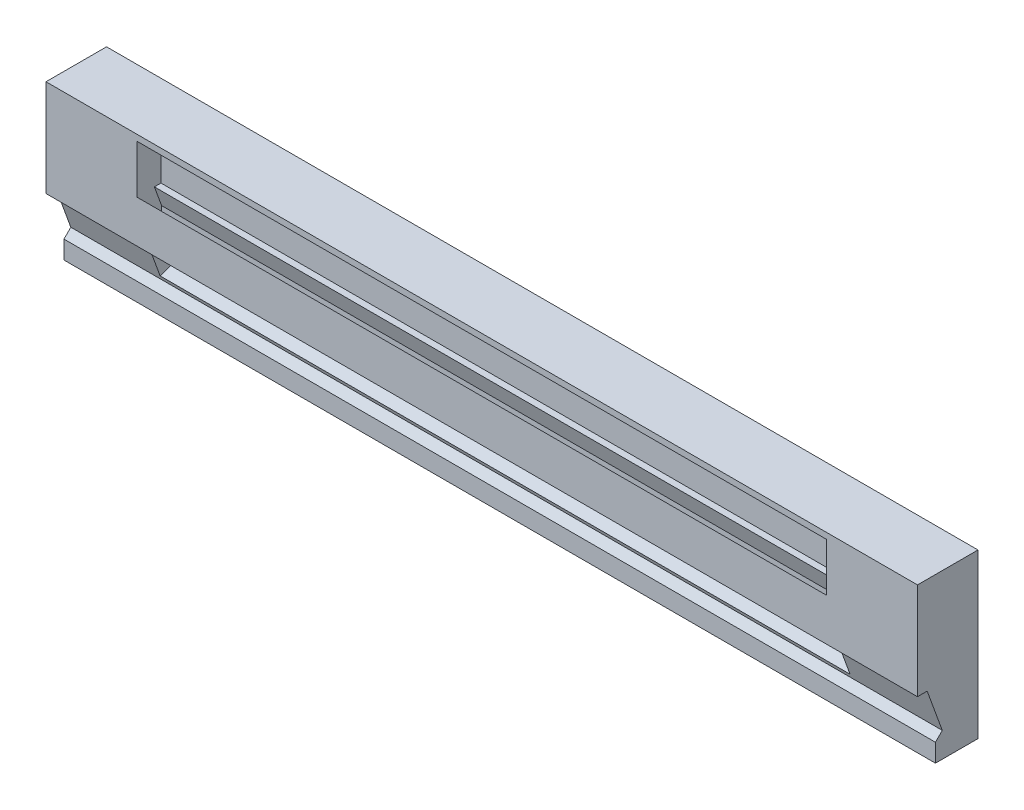
ISO-10303-21;
HEADER;
FILE_DESCRIPTION(('STEP AP214'),'2;1');
FILE_NAME('part.step','',(''),(''),'','','');
FILE_SCHEMA(('AUTOMOTIVE_DESIGN { 1 0 10303 214 1 1 1 1 }'));
ENDSEC;
DATA;
#1=APPLICATION_CONTEXT('core data for automotive mechanical design processes');
#2=APPLICATION_PROTOCOL_DEFINITION('international standard','automotive_design',2000,#1);
#3=PRODUCT_CONTEXT('',#1,'mechanical');
#4=PRODUCT('Part','Part','',(#3));
#5=PRODUCT_RELATED_PRODUCT_CATEGORY('part','',(#4));
#6=PRODUCT_DEFINITION_FORMATION('','',#4);
#7=PRODUCT_DEFINITION_CONTEXT('part definition',#1,'design');
#8=PRODUCT_DEFINITION('design','',#6,#7);
#9=PRODUCT_DEFINITION_SHAPE('','',#8);
#10=(LENGTH_UNIT() NAMED_UNIT(*) SI_UNIT(.MILLI.,.METRE.));
#11=(NAMED_UNIT(*) PLANE_ANGLE_UNIT() SI_UNIT($,.RADIAN.));
#12=(NAMED_UNIT(*) SI_UNIT($,.STERADIAN.) SOLID_ANGLE_UNIT());
#13=UNCERTAINTY_MEASURE_WITH_UNIT(LENGTH_MEASURE(1.E-05),#10,'distance_accuracy_value','');
#14=(GEOMETRIC_REPRESENTATION_CONTEXT(3) GLOBAL_UNCERTAINTY_ASSIGNED_CONTEXT((#13)) GLOBAL_UNIT_ASSIGNED_CONTEXT((#10,
#11,#12)) REPRESENTATION_CONTEXT('',''));
#15=CARTESIAN_POINT('',(0.,0.,0.));
#16=DIRECTION('',(0.,0.,1.));
#17=DIRECTION('',(1.,0.,0.));
#18=AXIS2_PLACEMENT_3D('',#15,#16,#17);
#19=CARTESIAN_POINT('',(914.4,19.05,0.));
#20=DIRECTION('',(0.,0.,-1.));
#21=DIRECTION('',(0.,1.,0.));
#22=AXIS2_PLACEMENT_3D('',#19,#20,#21);
#23=PLANE('',#22);
#24=DIRECTION('',(0.,-1.,0.));
#25=VECTOR('',#24,1.);
#26=CARTESIAN_POINT('',(0.,19.05,0.));
#27=LINE('',#26,#25);
#28=CARTESIAN_POINT('',(0.,19.05,0.));
#29=VERTEX_POINT('',#28);
#30=CARTESIAN_POINT('',(0.,0.,0.));
#31=VERTEX_POINT('',#30);
#32=EDGE_CURVE('E259',#29,#31,#27,.T.);
#33=ORIENTED_EDGE('',*,*,#32,.T.);
#34=DIRECTION('',(-1.,0.,0.));
#35=VECTOR('',#34,1.);
#36=CARTESIAN_POINT('',(914.4,0.,0.));
#37=LINE('',#36,#35);
#38=CARTESIAN_POINT('',(914.4,0.,0.));
#39=VERTEX_POINT('',#38);
#40=EDGE_CURVE('E41',#39,#31,#37,.T.);
#41=ORIENTED_EDGE('',*,*,#40,.F.);
#42=DIRECTION('',(0.,-1.,0.));
#43=VECTOR('',#42,1.);
#44=CARTESIAN_POINT('',(914.4,19.05,0.));
#45=LINE('',#44,#43);
#46=CARTESIAN_POINT('',(914.4,19.05,0.));
#47=VERTEX_POINT('',#46);
#48=EDGE_CURVE('E266',#47,#39,#45,.T.);
#49=ORIENTED_EDGE('',*,*,#48,.F.);
#50=DIRECTION('',(-1.,0.,0.));
#51=VECTOR('',#50,1.);
#52=CARTESIAN_POINT('',(914.4,19.05,0.));
#53=LINE('',#52,#51);
#54=EDGE_CURVE('E284',#47,#29,#53,.T.);
#55=ORIENTED_EDGE('',*,*,#54,.T.);
#56=EDGE_LOOP('',(#33,#41,#49,#55));
#57=FACE_BOUND('',#56,.T.);
#58=ADVANCED_FACE('F34',(#57),#23,.F.);
#59=CARTESIAN_POINT('',(914.4,0.,0.));
#60=DIRECTION('',(0.,1.,0.));
#61=DIRECTION('',(0.,0.,1.));
#62=AXIS2_PLACEMENT_3D('',#59,#60,#61);
#63=PLANE('',#62);
#64=DIRECTION('',(0.,0.,-1.));
#65=VECTOR('',#64,1.);
#66=CARTESIAN_POINT('',(0.,0.,0.));
#67=LINE('',#66,#65);
#68=CARTESIAN_POINT('',(0.,0.,-44.649353735457));
#69=VERTEX_POINT('',#68);
#70=EDGE_CURVE('E287',#31,#69,#67,.T.);
#71=ORIENTED_EDGE('',*,*,#70,.T.);
#72=DIRECTION('',(-1.,0.,0.));
#73=VECTOR('',#72,1.);
#74=CARTESIAN_POINT('',(914.4,0.,-44.649353735457));
#75=LINE('',#74,#73);
#76=CARTESIAN_POINT('',(914.4,0.,-44.649353735457));
#77=VERTEX_POINT('',#76);
#78=EDGE_CURVE('E319',#77,#69,#75,.T.);
#79=ORIENTED_EDGE('',*,*,#78,.F.);
#80=DIRECTION('',(0.,0.,-1.));
#81=VECTOR('',#80,1.);
#82=CARTESIAN_POINT('',(914.4,0.,0.));
#83=LINE('',#82,#81);
#84=EDGE_CURVE('E269',#39,#77,#83,.T.);
#85=ORIENTED_EDGE('',*,*,#84,.F.);
#86=ORIENTED_EDGE('',*,*,#40,.T.);
#87=EDGE_LOOP('',(#71,#79,#85,#86));
#88=FACE_BOUND('',#87,.T.);
#89=ADVANCED_FACE('F324',(#88),#63,.F.);
#90=CARTESIAN_POINT('',(914.4,0.,-44.649353735457));
#91=DIRECTION('',(0.,0.,1.));
#92=DIRECTION('',(1.,0.,0.));
#93=AXIS2_PLACEMENT_3D('',#90,#91,#92);
#94=PLANE('',#93);
#95=DIRECTION('',(0.,1.,0.));
#96=VECTOR('',#95,1.);
#97=CARTESIAN_POINT('',(0.,0.,-44.649353735457));
#98=LINE('',#97,#96);
#99=CARTESIAN_POINT('',(0.,171.45,-44.649353735457));
#100=VERTEX_POINT('',#99);
#101=EDGE_CURVE('E289',#69,#100,#98,.T.);
#102=ORIENTED_EDGE('',*,*,#101,.T.);
#103=DIRECTION('',(-1.,0.,0.));
#104=VECTOR('',#103,1.);
#105=CARTESIAN_POINT('',(914.4,171.45,-44.649353735457));
#106=LINE('',#105,#104);
#107=CARTESIAN_POINT('',(914.4,171.45,-44.649353735457));
#108=VERTEX_POINT('',#107);
#109=EDGE_CURVE('E316',#108,#100,#106,.T.);
#110=ORIENTED_EDGE('',*,*,#109,.F.);
#111=DIRECTION('',(0.,1.,0.));
#112=VECTOR('',#111,1.);
#113=CARTESIAN_POINT('',(914.4,0.,-44.649353735457));
#114=LINE('',#113,#112);
#115=EDGE_CURVE('E272',#77,#108,#114,.T.);
#116=ORIENTED_EDGE('',*,*,#115,.F.);
#117=ORIENTED_EDGE('',*,*,#78,.T.);
#118=EDGE_LOOP('',(#102,#110,#116,#117));
#119=FACE_BOUND('',#118,.T.);
#120=ADVANCED_FACE('F339',(#119),#94,.F.);
#121=CARTESIAN_POINT('',(914.4,171.45,-44.649353735457));
#122=DIRECTION('',(0.,-1.,0.));
#123=DIRECTION('',(0.,0.,-1.));
#124=AXIS2_PLACEMENT_3D('',#121,#122,#123);
#125=PLANE('',#124);
#126=DIRECTION('',(0.,0.,1.));
#127=VECTOR('',#126,1.);
#128=CARTESIAN_POINT('',(0.,171.45,-44.649353735457));
#129=LINE('',#128,#127);
#130=CARTESIAN_POINT('',(0.,171.45,18.850646264543));
#131=VERTEX_POINT('',#130);
#132=EDGE_CURVE('E291',#100,#131,#129,.T.);
#133=ORIENTED_EDGE('',*,*,#132,.T.);
#134=DIRECTION('',(-1.,0.,0.));
#135=VECTOR('',#134,1.);
#136=CARTESIAN_POINT('',(914.4,171.45,18.850646264543));
#137=LINE('',#136,#135);
#138=CARTESIAN_POINT('',(914.4,171.45,18.850646264543));
#139=VERTEX_POINT('',#138);
#140=EDGE_CURVE('E313',#139,#131,#137,.T.);
#141=ORIENTED_EDGE('',*,*,#140,.F.);
#142=DIRECTION('',(0.,0.,1.));
#143=VECTOR('',#142,1.);
#144=CARTESIAN_POINT('',(914.4,171.45,-44.649353735457));
#145=LINE('',#144,#143);
#146=EDGE_CURVE('E274',#108,#139,#145,.T.);
#147=ORIENTED_EDGE('',*,*,#146,.F.);
#148=ORIENTED_EDGE('',*,*,#109,.T.);
#149=EDGE_LOOP('',(#133,#141,#147,#148));
#150=FACE_BOUND('',#149,.T.);
#151=ADVANCED_FACE('F343',(#150),#125,.F.);
#152=CARTESIAN_POINT('',(914.4,171.45,18.850646264543));
#153=DIRECTION('',(0.,0.,-1.));
#154=DIRECTION('',(0.,1.,0.));
#155=AXIS2_PLACEMENT_3D('',#152,#153,#154);
#156=PLANE('',#155);
#157=DIRECTION('',(1.,0.,0.));
#158=VECTOR('',#157,1.);
#159=CARTESIAN_POINT('',(95.25,114.3,18.850646264543));
#160=LINE('',#159,#158);
#161=CARTESIAN_POINT('',(95.2500000000001,114.3,18.850646264543));
#162=VERTEX_POINT('',#161);
#163=CARTESIAN_POINT('',(819.15,114.3,18.850646264543));
#164=VERTEX_POINT('',#163);
#165=EDGE_CURVE('E249',#162,#164,#160,.T.);
#166=ORIENTED_EDGE('',*,*,#165,.F.);
#167=DIRECTION('',(0.,-1.,0.));
#168=VECTOR('',#167,1.);
#169=CARTESIAN_POINT('',(95.25,165.1,18.850646264543));
#170=LINE('',#169,#168);
#171=CARTESIAN_POINT('',(95.25,165.1,18.850646264543));
#172=VERTEX_POINT('',#171);
#173=EDGE_CURVE('E238',#172,#162,#170,.T.);
#174=ORIENTED_EDGE('',*,*,#173,.F.);
#175=DIRECTION('',(-1.,0.,0.));
#176=VECTOR('',#175,1.);
#177=CARTESIAN_POINT('',(95.25,165.1,18.850646264543));
#178=LINE('',#177,#176);
#179=CARTESIAN_POINT('',(819.15,165.1,18.850646264543));
#180=VERTEX_POINT('',#179);
#181=EDGE_CURVE('E243',#180,#172,#178,.T.);
#182=ORIENTED_EDGE('',*,*,#181,.F.);
#183=DIRECTION('',(0.,1.,0.));
#184=VECTOR('',#183,1.);
#185=CARTESIAN_POINT('',(819.15,165.1,18.850646264543));
#186=LINE('',#185,#184);
#187=EDGE_CURVE('E251',#164,#180,#186,.T.);
#188=ORIENTED_EDGE('',*,*,#187,.F.);
#189=EDGE_LOOP('',(#166,#174,#182,#188));
#190=FACE_BOUND('',#189,.T.);
#191=DIRECTION('',(0.,-1.,0.));
#192=VECTOR('',#191,1.);
#193=CARTESIAN_POINT('',(0.,171.45,18.850646264543));
#194=LINE('',#193,#192);
#195=CARTESIAN_POINT('',(0.,69.85,18.850646264543));
#196=VERTEX_POINT('',#195);
#197=EDGE_CURVE('E293',#131,#196,#194,.T.);
#198=ORIENTED_EDGE('',*,*,#197,.T.);
#199=DIRECTION('',(-1.,0.,0.));
#200=VECTOR('',#199,1.);
#201=CARTESIAN_POINT('',(914.4,69.85,18.850646264543));
#202=LINE('',#201,#200);
#203=CARTESIAN_POINT('',(914.4,69.85,18.850646264543));
#204=VERTEX_POINT('',#203);
#205=EDGE_CURVE('E310',#204,#196,#202,.T.);
#206=ORIENTED_EDGE('',*,*,#205,.F.);
#207=DIRECTION('',(0.,-1.,0.));
#208=VECTOR('',#207,1.);
#209=CARTESIAN_POINT('',(914.4,171.45,18.850646264543));
#210=LINE('',#209,#208);
#211=EDGE_CURVE('E276',#139,#204,#210,.T.);
#212=ORIENTED_EDGE('',*,*,#211,.F.);
#213=ORIENTED_EDGE('',*,*,#140,.T.);
#214=EDGE_LOOP('',(#198,#206,#212,#213));
#215=FACE_BOUND('',#214,.T.);
#216=ADVANCED_FACE('F364',(#190,#215),#156,.F.);
#217=CARTESIAN_POINT('',(914.4,69.85,18.850646264543));
#218=DIRECTION('',(0.,1.,0.));
#219=DIRECTION('',(0.,0.,1.));
#220=AXIS2_PLACEMENT_3D('',#217,#218,#219);
#221=PLANE('',#220);
#222=DIRECTION('',(0.,0.,-1.));
#223=VECTOR('',#222,1.);
#224=CARTESIAN_POINT('',(0.,69.85,18.850646264543));
#225=LINE('',#224,#223);
#226=CARTESIAN_POINT('',(0.,69.85,8.69064626454297));
#227=VERTEX_POINT('',#226);
#228=EDGE_CURVE('E295',#196,#227,#225,.T.);
#229=ORIENTED_EDGE('',*,*,#228,.T.);
#230=DIRECTION('',(-1.,0.,0.));
#231=VECTOR('',#230,1.);
#232=CARTESIAN_POINT('',(914.4,69.85,8.69064626454297));
#233=LINE('',#232,#231);
#234=CARTESIAN_POINT('',(95.2500000000001,69.85,8.69064626454298));
#235=VERTEX_POINT('',#234);
#236=EDGE_CURVE('E306',#235,#227,#233,.T.);
#237=ORIENTED_EDGE('',*,*,#236,.F.);
#238=DIRECTION('',(-1.,0.,0.));
#239=VECTOR('',#238,1.);
#240=CARTESIAN_POINT('',(95.2500000000001,69.85,8.69064626454298));
#241=LINE('',#240,#239);
#242=CARTESIAN_POINT('',(819.15,69.85,8.69064626454298));
#243=VERTEX_POINT('',#242);
#244=EDGE_CURVE('E192',#243,#235,#241,.T.);
#245=ORIENTED_EDGE('',*,*,#244,.F.);
#246=CARTESIAN_POINT('',(914.4,69.85,8.69064626454297));
#247=VERTEX_POINT('',#246);
#248=EDGE_CURVE('E307',#247,#243,#233,.T.);
#249=ORIENTED_EDGE('',*,*,#248,.F.);
#250=DIRECTION('',(0.,0.,-1.));
#251=VECTOR('',#250,1.);
#252=CARTESIAN_POINT('',(914.4,69.85,18.850646264543));
#253=LINE('',#252,#251);
#254=EDGE_CURVE('E278',#204,#247,#253,.T.);
#255=ORIENTED_EDGE('',*,*,#254,.F.);
#256=ORIENTED_EDGE('',*,*,#205,.T.);
#257=EDGE_LOOP('',(#229,#237,#245,#249,#255,#256));
#258=FACE_BOUND('',#257,.T.);
#259=ADVANCED_FACE('F359',(#258),#221,.F.);
#260=CARTESIAN_POINT('',(914.4,69.85,8.69064626454297));
#261=DIRECTION('',(0.,0.34202014332567,-0.939692620785908));
#262=DIRECTION('',(0.,0.939692620785908,0.34202014332567));
#263=AXIS2_PLACEMENT_3D('',#260,#261,#262);
#264=PLANE('',#263);
#265=DIRECTION('',(1.,0.,0.));
#266=VECTOR('',#265,1.);
#267=CARTESIAN_POINT('',(95.2500000000001,30.3903480405808,-5.67149250318967));
#268=LINE('',#267,#266);
#269=CARTESIAN_POINT('',(95.2500000000001,30.3903480405808,-5.67149250318968));
#270=VERTEX_POINT('',#269);
#271=CARTESIAN_POINT('',(819.15,30.3903480405808,-5.67149250318967));
#272=VERTEX_POINT('',#271);
#273=EDGE_CURVE('E201',#270,#272,#268,.T.);
#274=ORIENTED_EDGE('',*,*,#273,.F.);
#275=DIRECTION('',(0.,-0.939692620785908,-0.34202014332567));
#276=VECTOR('',#275,1.);
#277=CARTESIAN_POINT('',(95.2500000000001,69.85,8.69064626454298));
#278=LINE('',#277,#276);
#279=EDGE_CURVE('E48',#235,#270,#278,.T.);
#280=ORIENTED_EDGE('',*,*,#279,.F.);
#281=ORIENTED_EDGE('',*,*,#236,.T.);
#282=DIRECTION('',(0.,-0.939692620785908,-0.34202014332567));
#283=VECTOR('',#282,1.);
#284=CARTESIAN_POINT('',(0.,69.85,8.69064626454297));
#285=LINE('',#284,#283);
#286=CARTESIAN_POINT('',(0.,26.2342048968553,-7.18420489685533));
#287=VERTEX_POINT('',#286);
#288=EDGE_CURVE('E298',#227,#287,#285,.T.);
#289=ORIENTED_EDGE('',*,*,#288,.T.);
#290=DIRECTION('',(-1.,0.,0.));
#291=VECTOR('',#290,1.);
#292=CARTESIAN_POINT('',(914.4,26.2342048968553,-7.18420489685533));
#293=LINE('',#292,#291);
#294=CARTESIAN_POINT('',(914.4,26.2342048968553,-7.18420489685533));
#295=VERTEX_POINT('',#294);
#296=EDGE_CURVE('E303',#295,#287,#293,.T.);
#297=ORIENTED_EDGE('',*,*,#296,.F.);
#298=DIRECTION('',(0.,-0.939692620785908,-0.34202014332567));
#299=VECTOR('',#298,1.);
#300=CARTESIAN_POINT('',(914.4,69.85,8.69064626454297));
#301=LINE('',#300,#299);
#302=EDGE_CURVE('E280',#247,#295,#301,.T.);
#303=ORIENTED_EDGE('',*,*,#302,.F.);
#304=ORIENTED_EDGE('',*,*,#248,.T.);
#305=DIRECTION('',(0.,0.939692620785908,0.34202014332567));
#306=VECTOR('',#305,1.);
#307=CARTESIAN_POINT('',(819.15,69.85,8.69064626454298));
#308=LINE('',#307,#306);
#309=EDGE_CURVE('E195',#272,#243,#308,.T.);
#310=ORIENTED_EDGE('',*,*,#309,.F.);
#311=EDGE_LOOP('',(#274,#280,#281,#289,#297,#303,#304,#310));
#312=FACE_BOUND('',#311,.T.);
#313=ADVANCED_FACE('F355',(#312),#264,.F.);
#314=CARTESIAN_POINT('',(914.4,26.2342048968553,-7.18420489685533));
#315=DIRECTION('',(0.,-0.707106781186548,-0.707106781186546));
#316=DIRECTION('',(0.,0.707106781186547,-0.707106781186549));
#317=AXIS2_PLACEMENT_3D('',#314,#315,#316);
#318=PLANE('',#317);
#319=DIRECTION('',(0.,-0.707106781186547,0.707106781186549));
#320=VECTOR('',#319,1.);
#321=CARTESIAN_POINT('',(0.,26.2342048968553,-7.18420489685533));
#322=LINE('',#321,#320);
#323=EDGE_CURVE('E270',#287,#29,#322,.T.);
#324=ORIENTED_EDGE('',*,*,#323,.T.);
#325=ORIENTED_EDGE('',*,*,#54,.F.);
#326=DIRECTION('',(0.,-0.707106781186547,0.707106781186549));
#327=VECTOR('',#326,1.);
#328=CARTESIAN_POINT('',(914.4,26.2342048968553,-7.18420489685533));
#329=LINE('',#328,#327);
#330=EDGE_CURVE('E282',#295,#47,#329,.T.);
#331=ORIENTED_EDGE('',*,*,#330,.F.);
#332=ORIENTED_EDGE('',*,*,#296,.T.);
#333=EDGE_LOOP('',(#324,#325,#331,#332));
#334=FACE_BOUND('',#333,.T.);
#335=ADVANCED_FACE('F353',(#334),#318,.F.);
#336=CARTESIAN_POINT('',(914.4,0.,0.));
#337=DIRECTION('',(1.,0.,0.));
#338=DIRECTION('',(0.,0.,-1.));
#339=AXIS2_PLACEMENT_3D('',#336,#337,#338);
#340=PLANE('',#339);
#341=ORIENTED_EDGE('',*,*,#48,.T.);
#342=ORIENTED_EDGE('',*,*,#84,.T.);
#343=ORIENTED_EDGE('',*,*,#115,.T.);
#344=ORIENTED_EDGE('',*,*,#146,.T.);
#345=ORIENTED_EDGE('',*,*,#211,.T.);
#346=ORIENTED_EDGE('',*,*,#254,.T.);
#347=ORIENTED_EDGE('',*,*,#302,.T.);
#348=ORIENTED_EDGE('',*,*,#330,.T.);
#349=EDGE_LOOP('',(#341,#342,#343,#344,#345,#346,#347,#348));
#350=FACE_BOUND('',#349,.T.);
#351=ADVANCED_FACE('F347',(#350),#340,.T.);
#352=CARTESIAN_POINT('',(0.,0.,0.));
#353=DIRECTION('',(1.,0.,0.));
#354=DIRECTION('',(0.,0.,-1.));
#355=AXIS2_PLACEMENT_3D('',#352,#353,#354);
#356=PLANE('',#355);
#357=ORIENTED_EDGE('',*,*,#32,.F.);
#358=ORIENTED_EDGE('',*,*,#323,.F.);
#359=ORIENTED_EDGE('',*,*,#288,.F.);
#360=ORIENTED_EDGE('',*,*,#228,.F.);
#361=ORIENTED_EDGE('',*,*,#197,.F.);
#362=ORIENTED_EDGE('',*,*,#132,.F.);
#363=ORIENTED_EDGE('',*,*,#101,.F.);
#364=ORIENTED_EDGE('',*,*,#70,.F.);
#365=EDGE_LOOP('',(#357,#358,#359,#360,#361,#362,#363,#364));
#366=FACE_BOUND('',#365,.T.);
#367=ADVANCED_FACE('F332',(#366),#356,.F.);
#368=CARTESIAN_POINT('',(95.25,93.4954222961138,-7.21128865687306));
#369=DIRECTION('',(-1.,0.,0.));
#370=DIRECTION('',(0.,0.,1.));
#371=AXIS2_PLACEMENT_3D('',#368,#369,#370);
#372=PLANE('',#371);
#373=DIRECTION('',(0.,0.939692620785908,0.34202014332567));
#374=VECTOR('',#373,1.);
#375=CARTESIAN_POINT('',(95.25,42.6954222961138,-7.21128865687306));
#376=LINE('',#375,#374);
#377=CARTESIAN_POINT('',(95.2500000000001,71.7843011944731,3.376197410304));
#378=VERTEX_POINT('',#377);
#379=EDGE_CURVE('E56',#378,#162,#376,.T.);
#380=ORIENTED_EDGE('',*,*,#379,.F.);
#381=DIRECTION('',(0.,-0.34202014332567,0.939692620785908));
#382=VECTOR('',#381,1.);
#383=CARTESIAN_POINT('',(95.2500000000001,78.537311640472,-15.1775463034191));
#384=LINE('',#383,#382);
#385=EDGE_CURVE('E208',#378,#235,#384,.T.);
#386=ORIENTED_EDGE('',*,*,#385,.T.);
#387=ORIENTED_EDGE('',*,*,#279,.T.);
#388=DIRECTION('',(0.,-0.34202014332567,0.939692620785908));
#389=VECTOR('',#388,1.);
#390=CARTESIAN_POINT('',(95.2500000000001,39.0776596810528,-29.5396850711517));
#391=LINE('',#390,#389);
#392=CARTESIAN_POINT('',(95.2500000000001,39.0776596810528,-29.5396850711517));
#393=VERTEX_POINT('',#392);
#394=EDGE_CURVE('E169',#393,#270,#391,.T.);
#395=ORIENTED_EDGE('',*,*,#394,.F.);
#396=DIRECTION('',(0.,-0.939692620785908,-0.34202014332567));
#397=VECTOR('',#396,1.);
#398=CARTESIAN_POINT('',(95.2500000000001,78.537311640472,-15.1775463034191));
#399=LINE('',#398,#397);
#400=CARTESIAN_POINT('',(95.2500000000001,78.537311640472,-15.1775463034191));
#401=VERTEX_POINT('',#400);
#402=EDGE_CURVE('E174',#401,#393,#399,.T.);
#403=ORIENTED_EDGE('',*,*,#402,.F.);
#404=CARTESIAN_POINT('',(95.2500000000001,75.6378309786337,-7.21128865687306));
#405=VERTEX_POINT('',#404);
#406=EDGE_CURVE('E205',#401,#405,#384,.T.);
#407=ORIENTED_EDGE('',*,*,#406,.T.);
#408=DIRECTION('',(0.,-1.,0.));
#409=VECTOR('',#408,1.);
#410=CARTESIAN_POINT('',(95.25,93.4954222961138,-7.21128865687306));
#411=LINE('',#410,#409);
#412=CARTESIAN_POINT('',(95.25,93.4954222961138,-7.21128865687306));
#413=VERTEX_POINT('',#412);
#414=EDGE_CURVE('E239',#413,#405,#411,.T.);
#415=ORIENTED_EDGE('',*,*,#414,.F.);
#416=DIRECTION('',(0.,0.939692620785908,0.34202014332567));
#417=VECTOR('',#416,1.);
#418=CARTESIAN_POINT('',(95.25,93.4954222961138,-7.21128865687306));
#419=LINE('',#418,#417);
#420=CARTESIAN_POINT('',(95.25,114.3,0.360958363819831));
#421=VERTEX_POINT('',#420);
#422=EDGE_CURVE('E256',#413,#421,#419,.T.);
#423=ORIENTED_EDGE('',*,*,#422,.T.);
#424=DIRECTION('',(0.,0.,1.));
#425=VECTOR('',#424,1.);
#426=CARTESIAN_POINT('',(95.25,114.3,-6.54935373545703));
#427=LINE('',#426,#425);
#428=CARTESIAN_POINT('',(95.25,114.3,-6.54935373545703));
#429=VERTEX_POINT('',#428);
#430=EDGE_CURVE('E226',#429,#421,#427,.T.);
#431=ORIENTED_EDGE('',*,*,#430,.F.);
#432=DIRECTION('',(0.,-1.,0.));
#433=VECTOR('',#432,1.);
#434=CARTESIAN_POINT('',(95.25,165.1,-6.54935373545703));
#435=LINE('',#434,#433);
#436=CARTESIAN_POINT('',(95.25,165.1,-6.54935373545703));
#437=VERTEX_POINT('',#436);
#438=EDGE_CURVE('E214',#437,#429,#435,.T.);
#439=ORIENTED_EDGE('',*,*,#438,.F.);
#440=DIRECTION('',(0.,0.,1.));
#441=VECTOR('',#440,1.);
#442=CARTESIAN_POINT('',(95.25,165.1,-6.54935373545703));
#443=LINE('',#442,#441);
#444=EDGE_CURVE('E227',#437,#172,#443,.T.);
#445=ORIENTED_EDGE('',*,*,#444,.T.);
#446=ORIENTED_EDGE('',*,*,#173,.T.);
#447=EDGE_LOOP('',(#380,#386,#387,#395,#403,#407,#415,#423,#431,#439,#445,#446));
#448=FACE_BOUND('',#447,.T.);
#449=ADVANCED_FACE('F171',(#448),#372,.F.);
#450=CARTESIAN_POINT('',(95.25,93.4954222961138,-7.21128865687306));
#451=DIRECTION('',(0.,0.34202014332567,-0.939692620785908));
#452=DIRECTION('',(0.,0.939692620785908,0.34202014332567));
#453=AXIS2_PLACEMENT_3D('',#450,#451,#452);
#454=PLANE('',#453);
#455=DIRECTION('',(0.,0.939692620785908,0.34202014332567));
#456=VECTOR('',#455,1.);
#457=CARTESIAN_POINT('',(819.15,93.4954222961138,-7.21128865687306));
#458=LINE('',#457,#456);
#459=CARTESIAN_POINT('',(819.15,93.4954222961138,-7.21128865687306));
#460=VERTEX_POINT('',#459);
#461=CARTESIAN_POINT('',(819.15,114.3,0.360958363819831));
#462=VERTEX_POINT('',#461);
#463=EDGE_CURVE('E260',#460,#462,#458,.T.);
#464=ORIENTED_EDGE('',*,*,#463,.T.);
#465=DIRECTION('',(-1.,0.,0.));
#466=VECTOR('',#465,1.);
#467=CARTESIAN_POINT('',(95.25,114.3,0.360958363819831));
#468=LINE('',#467,#466);
#469=EDGE_CURVE('E229',#462,#421,#468,.T.);
#470=ORIENTED_EDGE('',*,*,#469,.T.);
#471=ORIENTED_EDGE('',*,*,#422,.F.);
#472=DIRECTION('',(-1.,0.,0.));
#473=VECTOR('',#472,1.);
#474=CARTESIAN_POINT('',(95.25,93.4954222961138,-7.21128865687306));
#475=LINE('',#474,#473);
#476=EDGE_CURVE('E245',#460,#413,#475,.T.);
#477=ORIENTED_EDGE('',*,*,#476,.F.);
#478=EDGE_LOOP('',(#464,#470,#471,#477));
#479=FACE_BOUND('',#478,.T.);
#480=ADVANCED_FACE('F427',(#479),#454,.F.);
#481=CARTESIAN_POINT('',(819.15,93.4954222961138,-7.21128865687306));
#482=DIRECTION('',(1.,0.,0.));
#483=DIRECTION('',(0.,0.,-1.));
#484=AXIS2_PLACEMENT_3D('',#481,#482,#483);
#485=PLANE('',#484);
#486=DIRECTION('',(0.,1.,0.));
#487=VECTOR('',#486,1.);
#488=CARTESIAN_POINT('',(819.15,93.4954222961138,-7.21128865687306));
#489=LINE('',#488,#487);
#490=CARTESIAN_POINT('',(819.15,75.6378309786337,-7.21128865687306));
#491=VERTEX_POINT('',#490);
#492=EDGE_CURVE('E242',#491,#460,#489,.T.);
#493=ORIENTED_EDGE('',*,*,#492,.F.);
#494=DIRECTION('',(0.,-0.34202014332567,0.939692620785908));
#495=VECTOR('',#494,1.);
#496=CARTESIAN_POINT('',(819.15,78.537311640472,-15.1775463034191));
#497=LINE('',#496,#495);
#498=CARTESIAN_POINT('',(819.15,78.537311640472,-15.1775463034191));
#499=VERTEX_POINT('',#498);
#500=EDGE_CURVE('E209',#499,#491,#497,.T.);
#501=ORIENTED_EDGE('',*,*,#500,.F.);
#502=DIRECTION('',(0.,0.939692620785908,0.34202014332567));
#503=VECTOR('',#502,1.);
#504=CARTESIAN_POINT('',(819.15,78.537311640472,-15.1775463034191));
#505=LINE('',#504,#503);
#506=CARTESIAN_POINT('',(819.15,39.0776596810528,-29.5396850711517));
#507=VERTEX_POINT('',#506);
#508=EDGE_CURVE('E188',#507,#499,#505,.T.);
#509=ORIENTED_EDGE('',*,*,#508,.F.);
#510=DIRECTION('',(0.,-0.34202014332567,0.939692620785908));
#511=VECTOR('',#510,1.);
#512=CARTESIAN_POINT('',(819.15,39.0776596810528,-29.5396850711517));
#513=LINE('',#512,#511);
#514=EDGE_CURVE('E179',#507,#272,#513,.T.);
#515=ORIENTED_EDGE('',*,*,#514,.T.);
#516=ORIENTED_EDGE('',*,*,#309,.T.);
#517=CARTESIAN_POINT('',(819.15,71.7843011944731,3.376197410304));
#518=VERTEX_POINT('',#517);
#519=EDGE_CURVE('E211',#518,#243,#497,.T.);
#520=ORIENTED_EDGE('',*,*,#519,.F.);
#521=DIRECTION('',(0.,0.939692620785908,0.34202014332567));
#522=VECTOR('',#521,1.);
#523=CARTESIAN_POINT('',(819.15,42.6954222961138,-7.21128865687306));
#524=LINE('',#523,#522);
#525=EDGE_CURVE('E263',#518,#164,#524,.T.);
#526=ORIENTED_EDGE('',*,*,#525,.T.);
#527=ORIENTED_EDGE('',*,*,#187,.T.);
#528=DIRECTION('',(0.,0.,1.));
#529=VECTOR('',#528,1.);
#530=CARTESIAN_POINT('',(819.15,165.1,-6.54935373545703));
#531=LINE('',#530,#529);
#532=CARTESIAN_POINT('',(819.15,165.1,-6.54935373545703));
#533=VERTEX_POINT('',#532);
#534=EDGE_CURVE('E230',#533,#180,#531,.T.);
#535=ORIENTED_EDGE('',*,*,#534,.F.);
#536=DIRECTION('',(0.,1.,0.));
#537=VECTOR('',#536,1.);
#538=CARTESIAN_POINT('',(819.15,165.1,-6.54935373545703));
#539=LINE('',#538,#537);
#540=CARTESIAN_POINT('',(819.15,114.3,-6.54935373545703));
#541=VERTEX_POINT('',#540);
#542=EDGE_CURVE('E220',#541,#533,#539,.T.);
#543=ORIENTED_EDGE('',*,*,#542,.F.);
#544=DIRECTION('',(0.,0.,1.));
#545=VECTOR('',#544,1.);
#546=CARTESIAN_POINT('',(819.15,114.3,-6.54935373545703));
#547=LINE('',#546,#545);
#548=EDGE_CURVE('E232',#541,#462,#547,.T.);
#549=ORIENTED_EDGE('',*,*,#548,.T.);
#550=ORIENTED_EDGE('',*,*,#463,.F.);
#551=EDGE_LOOP('',(#493,#501,#509,#515,#516,#520,#526,#527,#535,#543,#549,#550));
#552=FACE_BOUND('',#551,.T.);
#553=ADVANCED_FACE('F432',(#552),#485,.F.);
#554=CARTESIAN_POINT('',(95.25,42.6954222961138,-7.21128865687306));
#555=DIRECTION('',(0.,-0.34202014332567,0.939692620785908));
#556=DIRECTION('',(0.,-0.939692620785908,-0.34202014332567));
#557=AXIS2_PLACEMENT_3D('',#554,#555,#556);
#558=PLANE('',#557);
#559=ORIENTED_EDGE('',*,*,#525,.F.);
#560=DIRECTION('',(-1.,0.,0.));
#561=VECTOR('',#560,1.);
#562=CARTESIAN_POINT('',(95.25,71.7843011944731,3.376197410304));
#563=LINE('',#562,#561);
#564=EDGE_CURVE('E207',#518,#378,#563,.T.);
#565=ORIENTED_EDGE('',*,*,#564,.T.);
#566=ORIENTED_EDGE('',*,*,#379,.T.);
#567=ORIENTED_EDGE('',*,*,#165,.T.);
#568=EDGE_LOOP('',(#559,#565,#566,#567));
#569=FACE_BOUND('',#568,.T.);
#570=ADVANCED_FACE('F497',(#569),#558,.F.);
#571=CARTESIAN_POINT('',(0.,-71.6045777038862,-7.21128865687306));
#572=DIRECTION('',(0.,0.,1.));
#573=DIRECTION('',(1.,0.,0.));
#574=AXIS2_PLACEMENT_3D('',#571,#572,#573);
#575=PLANE('',#574);
#576=DIRECTION('',(-1.,0.,0.));
#577=VECTOR('',#576,1.);
#578=CARTESIAN_POINT('',(0.,75.6378309786337,-7.21128865687306));
#579=LINE('',#578,#577);
#580=EDGE_CURVE('E11',#491,#405,#579,.T.);
#581=ORIENTED_EDGE('',*,*,#580,.F.);
#582=ORIENTED_EDGE('',*,*,#492,.T.);
#583=ORIENTED_EDGE('',*,*,#476,.T.);
#584=ORIENTED_EDGE('',*,*,#414,.T.);
#585=EDGE_LOOP('',(#581,#582,#583,#584));
#586=FACE_BOUND('',#585,.T.);
#587=ADVANCED_FACE('F446',(#586),#575,.T.);
#588=CARTESIAN_POINT('',(95.25,114.3,-6.54935373545703));
#589=DIRECTION('',(0.,-1.,0.));
#590=DIRECTION('',(0.,0.,-1.));
#591=AXIS2_PLACEMENT_3D('',#588,#589,#590);
#592=PLANE('',#591);
#593=ORIENTED_EDGE('',*,*,#548,.F.);
#594=DIRECTION('',(1.,0.,0.));
#595=VECTOR('',#594,1.);
#596=CARTESIAN_POINT('',(95.25,114.3,-6.54935373545703));
#597=LINE('',#596,#595);
#598=EDGE_CURVE('E217',#429,#541,#597,.T.);
#599=ORIENTED_EDGE('',*,*,#598,.F.);
#600=ORIENTED_EDGE('',*,*,#430,.T.);
#601=ORIENTED_EDGE('',*,*,#469,.F.);
#602=EDGE_LOOP('',(#593,#599,#600,#601));
#603=FACE_BOUND('',#602,.T.);
#604=ADVANCED_FACE('F440',(#603),#592,.F.);
#605=CARTESIAN_POINT('',(95.25,165.1,-6.54935373545703));
#606=DIRECTION('',(0.,1.,0.));
#607=DIRECTION('',(0.,0.,1.));
#608=AXIS2_PLACEMENT_3D('',#605,#606,#607);
#609=PLANE('',#608);
#610=ORIENTED_EDGE('',*,*,#181,.T.);
#611=ORIENTED_EDGE('',*,*,#444,.F.);
#612=DIRECTION('',(-1.,0.,0.));
#613=VECTOR('',#612,1.);
#614=CARTESIAN_POINT('',(95.25,165.1,-6.54935373545703));
#615=LINE('',#614,#613);
#616=EDGE_CURVE('E223',#533,#437,#615,.T.);
#617=ORIENTED_EDGE('',*,*,#616,.F.);
#618=ORIENTED_EDGE('',*,*,#534,.T.);
#619=EDGE_LOOP('',(#610,#611,#617,#618));
#620=FACE_BOUND('',#619,.T.);
#621=ADVANCED_FACE('F445',(#620),#609,.F.);
#622=CARTESIAN_POINT('',(0.,0.,-6.54935373545703));
#623=DIRECTION('',(0.,0.,1.));
#624=DIRECTION('',(1.,0.,0.));
#625=AXIS2_PLACEMENT_3D('',#622,#623,#624);
#626=PLANE('',#625);
#627=ORIENTED_EDGE('',*,*,#438,.T.);
#628=ORIENTED_EDGE('',*,*,#598,.T.);
#629=ORIENTED_EDGE('',*,*,#542,.T.);
#630=ORIENTED_EDGE('',*,*,#616,.T.);
#631=EDGE_LOOP('',(#627,#628,#629,#630));
#632=FACE_BOUND('',#631,.T.);
#633=ADVANCED_FACE('F458',(#632),#626,.T.);
#634=CARTESIAN_POINT('',(95.2500000000001,78.537311640472,-15.1775463034191));
#635=DIRECTION('',(0.,0.939692620785908,0.34202014332567));
#636=DIRECTION('',(0.,-0.34202014332567,0.939692620785908));
#637=AXIS2_PLACEMENT_3D('',#634,#635,#636);
#638=PLANE('',#637);
#639=ORIENTED_EDGE('',*,*,#519,.T.);
#640=ORIENTED_EDGE('',*,*,#244,.T.);
#641=ORIENTED_EDGE('',*,*,#385,.F.);
#642=ORIENTED_EDGE('',*,*,#564,.F.);
#643=EDGE_LOOP('',(#639,#640,#641,#642));
#644=FACE_BOUND('',#643,.T.);
#645=ADVANCED_FACE('F468',(#644),#638,.F.);
#646=ORIENTED_EDGE('',*,*,#580,.T.);
#647=ORIENTED_EDGE('',*,*,#406,.F.);
#648=DIRECTION('',(-1.,0.,0.));
#649=VECTOR('',#648,1.);
#650=CARTESIAN_POINT('',(95.2500000000001,78.537311640472,-15.1775463034191));
#651=LINE('',#650,#649);
#652=EDGE_CURVE('E180',#499,#401,#651,.T.);
#653=ORIENTED_EDGE('',*,*,#652,.F.);
#654=ORIENTED_EDGE('',*,*,#500,.T.);
#655=EDGE_LOOP('',(#646,#647,#653,#654));
#656=FACE_BOUND('',#655,.T.);
#657=ADVANCED_FACE('F522',(#656),#638,.F.);
#658=CARTESIAN_POINT('',(95.2500000000001,39.0776596810528,-29.5396850711517));
#659=DIRECTION('',(0.,-0.939692620785908,-0.34202014332567));
#660=DIRECTION('',(0.,0.34202014332567,-0.939692620785908));
#661=AXIS2_PLACEMENT_3D('',#658,#659,#660);
#662=PLANE('',#661);
#663=ORIENTED_EDGE('',*,*,#273,.T.);
#664=ORIENTED_EDGE('',*,*,#514,.F.);
#665=DIRECTION('',(1.,0.,0.));
#666=VECTOR('',#665,1.);
#667=CARTESIAN_POINT('',(95.2500000000001,39.0776596810528,-29.5396850711517));
#668=LINE('',#667,#666);
#669=EDGE_CURVE('E183',#393,#507,#668,.T.);
#670=ORIENTED_EDGE('',*,*,#669,.F.);
#671=ORIENTED_EDGE('',*,*,#394,.T.);
#672=EDGE_LOOP('',(#663,#664,#670,#671));
#673=FACE_BOUND('',#672,.T.);
#674=ADVANCED_FACE('F184',(#673),#662,.F.);
#675=CARTESIAN_POINT('',(0.,14.0650895950333,-38.6435160649601));
#676=DIRECTION('',(0.,-0.34202014332567,0.939692620785908));
#677=DIRECTION('',(0.,-0.939692620785908,-0.34202014332567));
#678=AXIS2_PLACEMENT_3D('',#675,#676,#677);
#679=PLANE('',#678);
#680=ORIENTED_EDGE('',*,*,#402,.T.);
#681=ORIENTED_EDGE('',*,*,#669,.T.);
#682=ORIENTED_EDGE('',*,*,#508,.T.);
#683=ORIENTED_EDGE('',*,*,#652,.T.);
#684=EDGE_LOOP('',(#680,#681,#682,#683));
#685=FACE_BOUND('',#684,.T.);
#686=ADVANCED_FACE('F190',(#685),#679,.T.);
#687=CLOSED_SHELL('',(#58,#89,#120,#151,#216,#259,#313,#335,#351,#367,#449,#480,#553,#570,#587,
#604,#621,#633,#645,#657,#674,#686));
#688=MANIFOLD_SOLID_BREP('B2',#687);
#689=ADVANCED_BREP_SHAPE_REPRESENTATION('',(#18,#688),#14);
#690=SHAPE_DEFINITION_REPRESENTATION(#9,#689);
ENDSEC;
END-ISO-10303-21;
